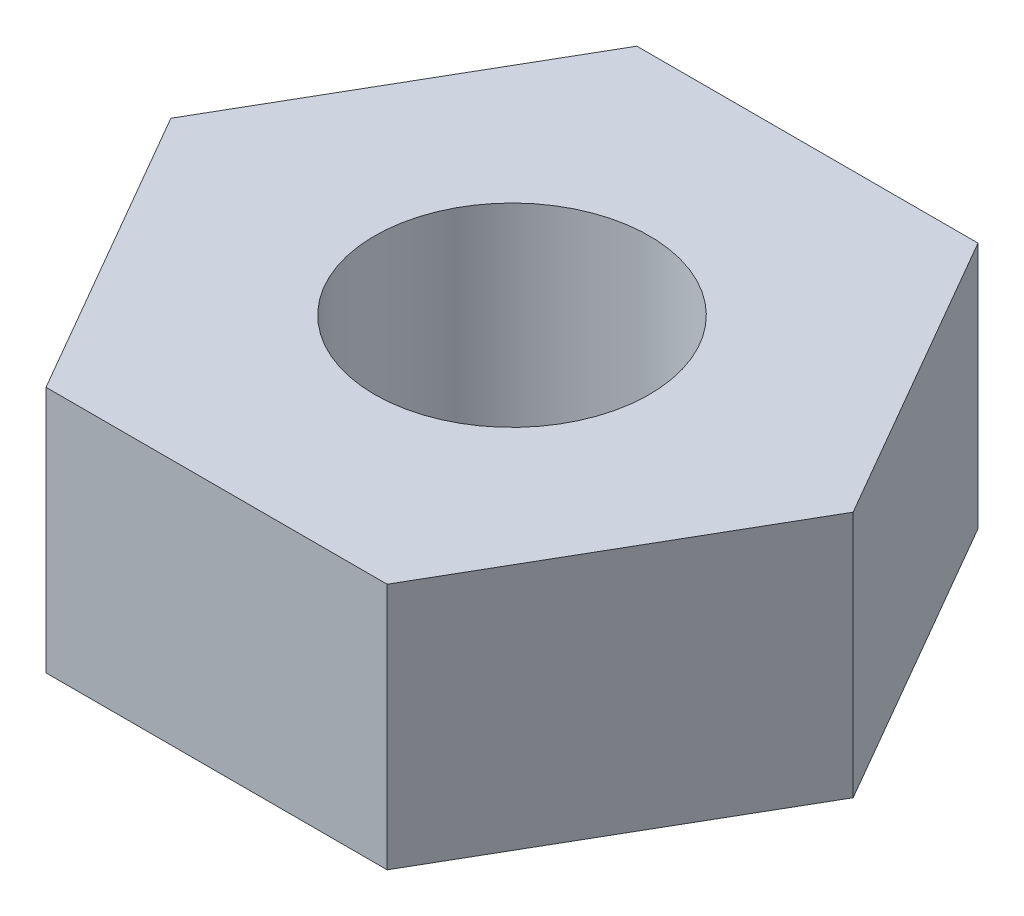
ISO-10303-21;
HEADER;
FILE_DESCRIPTION(('STEP AP214'),'2;1');
FILE_NAME('part.step','',(''),(''),'','','');
FILE_SCHEMA(('AUTOMOTIVE_DESIGN { 1 0 10303 214 1 1 1 1 }'));
ENDSEC;
DATA;
#1=APPLICATION_CONTEXT('core data for automotive mechanical design processes');
#2=APPLICATION_PROTOCOL_DEFINITION('international standard','automotive_design',2000,#1);
#3=PRODUCT_CONTEXT('',#1,'mechanical');
#4=PRODUCT('Part','Part','',(#3));
#5=PRODUCT_RELATED_PRODUCT_CATEGORY('part','',(#4));
#6=PRODUCT_DEFINITION_FORMATION('','',#4);
#7=PRODUCT_DEFINITION_CONTEXT('part definition',#1,'design');
#8=PRODUCT_DEFINITION('design','',#6,#7);
#9=PRODUCT_DEFINITION_SHAPE('','',#8);
#10=(LENGTH_UNIT() NAMED_UNIT(*) SI_UNIT(.MILLI.,.METRE.));
#11=(NAMED_UNIT(*) PLANE_ANGLE_UNIT() SI_UNIT($,.RADIAN.));
#12=(NAMED_UNIT(*) SI_UNIT($,.STERADIAN.) SOLID_ANGLE_UNIT());
#13=UNCERTAINTY_MEASURE_WITH_UNIT(LENGTH_MEASURE(1.E-05),#10,'distance_accuracy_value','');
#14=(GEOMETRIC_REPRESENTATION_CONTEXT(3) GLOBAL_UNCERTAINTY_ASSIGNED_CONTEXT((#13)) GLOBAL_UNIT_ASSIGNED_CONTEXT((#10,
#11,#12)) REPRESENTATION_CONTEXT('',''));
#15=CARTESIAN_POINT('',(0.,0.,0.));
#16=DIRECTION('',(0.,0.,1.));
#17=DIRECTION('',(1.,0.,0.));
#18=AXIS2_PLACEMENT_3D('',#15,#16,#17);
#19=CARTESIAN_POINT('',(0.,3.6,0.));
#20=DIRECTION('',(0.,1.,0.));
#21=DIRECTION('',(0.,0.,1.));
#22=AXIS2_PLACEMENT_3D('',#19,#20,#21);
#23=PLANE('',#22);
#24=DIRECTION('',(0.5,0.,-0.866025403784439));
#25=VECTOR('',#24,1.);
#26=CARTESIAN_POINT('',(2.48260615751539,3.6,4.3));
#27=LINE('',#26,#25);
#28=CARTESIAN_POINT('',(2.48260615751539,3.6,4.3));
#29=VERTEX_POINT('',#28);
#30=CARTESIAN_POINT('',(4.96521231503078,3.6,0.));
#31=VERTEX_POINT('',#30);
#32=EDGE_CURVE('E129',#29,#31,#27,.T.);
#33=ORIENTED_EDGE('',*,*,#32,.T.);
#34=DIRECTION('',(-0.5,0.,-0.866025403784438));
#35=VECTOR('',#34,1.);
#36=CARTESIAN_POINT('',(4.96521231503078,3.6,0.));
#37=LINE('',#36,#35);
#38=CARTESIAN_POINT('',(2.48260615751539,3.6,-4.3));
#39=VERTEX_POINT('',#38);
#40=EDGE_CURVE('E87',#31,#39,#37,.T.);
#41=ORIENTED_EDGE('',*,*,#40,.T.);
#42=DIRECTION('',(-1.,0.,0.));
#43=VECTOR('',#42,1.);
#44=CARTESIAN_POINT('',(2.48260615751539,3.6,-4.3));
#45=LINE('',#44,#43);
#46=CARTESIAN_POINT('',(-2.48260615751539,3.6,-4.3));
#47=VERTEX_POINT('',#46);
#48=EDGE_CURVE('E100',#39,#47,#45,.T.);
#49=ORIENTED_EDGE('',*,*,#48,.T.);
#50=DIRECTION('',(-0.5,0.,0.866025403784439));
#51=VECTOR('',#50,1.);
#52=CARTESIAN_POINT('',(-2.48260615751539,3.6,-4.3));
#53=LINE('',#52,#51);
#54=CARTESIAN_POINT('',(-4.96521231503078,3.6,0.));
#55=VERTEX_POINT('',#54);
#56=EDGE_CURVE('E94',#47,#55,#53,.T.);
#57=ORIENTED_EDGE('',*,*,#56,.T.);
#58=DIRECTION('',(0.5,0.,0.866025403784439));
#59=VECTOR('',#58,1.);
#60=CARTESIAN_POINT('',(-4.96521231503078,3.6,0.));
#61=LINE('',#60,#59);
#62=CARTESIAN_POINT('',(-2.48260615751539,3.6,4.3));
#63=VERTEX_POINT('',#62);
#64=EDGE_CURVE('E98',#55,#63,#61,.T.);
#65=ORIENTED_EDGE('',*,*,#64,.T.);
#66=DIRECTION('',(1.,0.,0.));
#67=VECTOR('',#66,1.);
#68=CARTESIAN_POINT('',(-2.48260615751539,3.6,4.3));
#69=LINE('',#68,#67);
#70=EDGE_CURVE('E50',#63,#29,#69,.T.);
#71=ORIENTED_EDGE('',*,*,#70,.T.);
#72=EDGE_LOOP('',(#33,#41,#49,#57,#65,#71));
#73=FACE_BOUND('',#72,.T.);
#74=CARTESIAN_POINT('',(0.,3.6,0.));
#75=DIRECTION('',(0.,1.,0.));
#76=DIRECTION('',(0.,0.,1.));
#77=AXIS2_PLACEMENT_3D('',#74,#75,#76);
#78=CIRCLE('',#77,2.);
#79=CARTESIAN_POINT('',(0.,3.6,2.));
#80=VERTEX_POINT('',#79);
#81=EDGE_CURVE('E122',#80,#80,#78,.T.);
#82=ORIENTED_EDGE('',*,*,#81,.F.);
#83=EDGE_LOOP('',(#82));
#84=FACE_BOUND('',#83,.T.);
#85=ADVANCED_FACE('F33',(#73,#84),#23,.T.);
#86=CARTESIAN_POINT('',(0.,0.,0.));
#87=DIRECTION('',(0.,1.,0.));
#88=DIRECTION('',(0.,0.,1.));
#89=AXIS2_PLACEMENT_3D('',#86,#87,#88);
#90=PLANE('',#89);
#91=DIRECTION('',(0.5,0.,-0.866025403784439));
#92=VECTOR('',#91,1.);
#93=CARTESIAN_POINT('',(2.48260615751539,0.,4.3));
#94=LINE('',#93,#92);
#95=CARTESIAN_POINT('',(2.48260615751539,0.,4.3));
#96=VERTEX_POINT('',#95);
#97=CARTESIAN_POINT('',(4.96521231503078,0.,0.));
#98=VERTEX_POINT('',#97);
#99=EDGE_CURVE('E118',#96,#98,#94,.T.);
#100=ORIENTED_EDGE('',*,*,#99,.F.);
#101=DIRECTION('',(1.,0.,0.));
#102=VECTOR('',#101,1.);
#103=CARTESIAN_POINT('',(-2.48260615751539,0.,4.3));
#104=LINE('',#103,#102);
#105=CARTESIAN_POINT('',(-2.48260615751539,0.,4.3));
#106=VERTEX_POINT('',#105);
#107=EDGE_CURVE('E79',#106,#96,#104,.T.);
#108=ORIENTED_EDGE('',*,*,#107,.F.);
#109=DIRECTION('',(0.5,0.,0.866025403784439));
#110=VECTOR('',#109,1.);
#111=CARTESIAN_POINT('',(-4.96521231503078,0.,0.));
#112=LINE('',#111,#110);
#113=CARTESIAN_POINT('',(-4.96521231503078,0.,0.));
#114=VERTEX_POINT('',#113);
#115=EDGE_CURVE('E73',#114,#106,#112,.T.);
#116=ORIENTED_EDGE('',*,*,#115,.F.);
#117=DIRECTION('',(-0.5,0.,0.866025403784439));
#118=VECTOR('',#117,1.);
#119=CARTESIAN_POINT('',(-2.48260615751539,0.,-4.3));
#120=LINE('',#119,#118);
#121=CARTESIAN_POINT('',(-2.48260615751539,0.,-4.3));
#122=VERTEX_POINT('',#121);
#123=EDGE_CURVE('E108',#122,#114,#120,.T.);
#124=ORIENTED_EDGE('',*,*,#123,.F.);
#125=DIRECTION('',(-1.,0.,0.));
#126=VECTOR('',#125,1.);
#127=CARTESIAN_POINT('',(2.48260615751539,0.,-4.3));
#128=LINE('',#127,#126);
#129=CARTESIAN_POINT('',(2.48260615751539,0.,-4.3));
#130=VERTEX_POINT('',#129);
#131=EDGE_CURVE('E124',#130,#122,#128,.T.);
#132=ORIENTED_EDGE('',*,*,#131,.F.);
#133=DIRECTION('',(-0.5,0.,-0.866025403784438));
#134=VECTOR('',#133,1.);
#135=CARTESIAN_POINT('',(4.96521231503078,0.,0.));
#136=LINE('',#135,#134);
#137=EDGE_CURVE('E121',#98,#130,#136,.T.);
#138=ORIENTED_EDGE('',*,*,#137,.F.);
#139=EDGE_LOOP('',(#100,#108,#116,#124,#132,#138));
#140=FACE_BOUND('',#139,.T.);
#141=CARTESIAN_POINT('',(0.,0.,0.));
#142=DIRECTION('',(0.,1.,0.));
#143=DIRECTION('',(0.,0.,1.));
#144=AXIS2_PLACEMENT_3D('',#141,#142,#143);
#145=CIRCLE('',#144,2.);
#146=CARTESIAN_POINT('',(0.,0.,2.));
#147=VERTEX_POINT('',#146);
#148=EDGE_CURVE('E222',#147,#147,#145,.T.);
#149=ORIENTED_EDGE('',*,*,#148,.T.);
#150=EDGE_LOOP('',(#149));
#151=FACE_BOUND('',#150,.T.);
#152=ADVANCED_FACE('F138',(#140,#151),#90,.F.);
#153=CARTESIAN_POINT('',(2.48260615751539,3.6,4.3));
#154=DIRECTION('',(-0.866025403784439,0.,-0.5));
#155=DIRECTION('',(-0.5,0.,0.866025403784439));
#156=AXIS2_PLACEMENT_3D('',#153,#154,#155);
#157=PLANE('',#156);
#158=ORIENTED_EDGE('',*,*,#99,.T.);
#159=DIRECTION('',(0.,-1.,0.));
#160=VECTOR('',#159,1.);
#161=CARTESIAN_POINT('',(4.96521231503078,3.6,0.));
#162=LINE('',#161,#160);
#163=EDGE_CURVE('E11',#31,#98,#162,.T.);
#164=ORIENTED_EDGE('',*,*,#163,.F.);
#165=ORIENTED_EDGE('',*,*,#32,.F.);
#166=DIRECTION('',(0.,-1.,0.));
#167=VECTOR('',#166,1.);
#168=CARTESIAN_POINT('',(2.48260615751539,3.6,4.3));
#169=LINE('',#168,#167);
#170=EDGE_CURVE('E114',#29,#96,#169,.T.);
#171=ORIENTED_EDGE('',*,*,#170,.T.);
#172=EDGE_LOOP('',(#158,#164,#165,#171));
#173=FACE_BOUND('',#172,.T.);
#174=ADVANCED_FACE('F35',(#173),#157,.F.);
#175=CARTESIAN_POINT('',(4.96521231503078,3.6,0.));
#176=DIRECTION('',(-0.866025403784438,0.,0.5));
#177=DIRECTION('',(0.5,0.,0.866025403784439));
#178=AXIS2_PLACEMENT_3D('',#175,#176,#177);
#179=PLANE('',#178);
#180=ORIENTED_EDGE('',*,*,#137,.T.);
#181=DIRECTION('',(0.,-1.,0.));
#182=VECTOR('',#181,1.);
#183=CARTESIAN_POINT('',(2.48260615751539,3.6,-4.3));
#184=LINE('',#183,#182);
#185=EDGE_CURVE('E42',#39,#130,#184,.T.);
#186=ORIENTED_EDGE('',*,*,#185,.F.);
#187=ORIENTED_EDGE('',*,*,#40,.F.);
#188=ORIENTED_EDGE('',*,*,#163,.T.);
#189=EDGE_LOOP('',(#180,#186,#187,#188));
#190=FACE_BOUND('',#189,.T.);
#191=ADVANCED_FACE('F163',(#190),#179,.F.);
#192=CARTESIAN_POINT('',(2.48260615751539,3.6,-4.3));
#193=DIRECTION('',(0.,0.,1.));
#194=DIRECTION('',(1.,0.,0.));
#195=AXIS2_PLACEMENT_3D('',#192,#193,#194);
#196=PLANE('',#195);
#197=ORIENTED_EDGE('',*,*,#131,.T.);
#198=DIRECTION('',(0.,-1.,0.));
#199=VECTOR('',#198,1.);
#200=CARTESIAN_POINT('',(-2.48260615751539,3.6,-4.3));
#201=LINE('',#200,#199);
#202=EDGE_CURVE('E109',#47,#122,#201,.T.);
#203=ORIENTED_EDGE('',*,*,#202,.F.);
#204=ORIENTED_EDGE('',*,*,#48,.F.);
#205=ORIENTED_EDGE('',*,*,#185,.T.);
#206=EDGE_LOOP('',(#197,#203,#204,#205));
#207=FACE_BOUND('',#206,.T.);
#208=ADVANCED_FACE('F135',(#207),#196,.F.);
#209=CARTESIAN_POINT('',(-2.48260615751539,3.6,-4.3));
#210=DIRECTION('',(0.866025403784439,0.,0.5));
#211=DIRECTION('',(0.5,0.,-0.866025403784439));
#212=AXIS2_PLACEMENT_3D('',#209,#210,#211);
#213=PLANE('',#212);
#214=ORIENTED_EDGE('',*,*,#123,.T.);
#215=DIRECTION('',(0.,-1.,0.));
#216=VECTOR('',#215,1.);
#217=CARTESIAN_POINT('',(-4.96521231503078,3.6,0.));
#218=LINE('',#217,#216);
#219=EDGE_CURVE('E105',#55,#114,#218,.T.);
#220=ORIENTED_EDGE('',*,*,#219,.F.);
#221=ORIENTED_EDGE('',*,*,#56,.F.);
#222=ORIENTED_EDGE('',*,*,#202,.T.);
#223=EDGE_LOOP('',(#214,#220,#221,#222));
#224=FACE_BOUND('',#223,.T.);
#225=ADVANCED_FACE('F106',(#224),#213,.F.);
#226=CARTESIAN_POINT('',(-4.96521231503078,3.6,0.));
#227=DIRECTION('',(0.866025403784439,0.,-0.5));
#228=DIRECTION('',(-0.5,0.,-0.866025403784439));
#229=AXIS2_PLACEMENT_3D('',#226,#227,#228);
#230=PLANE('',#229);
#231=ORIENTED_EDGE('',*,*,#115,.T.);
#232=DIRECTION('',(0.,-1.,0.));
#233=VECTOR('',#232,1.);
#234=CARTESIAN_POINT('',(-2.48260615751539,3.6,4.3));
#235=LINE('',#234,#233);
#236=EDGE_CURVE('E110',#63,#106,#235,.T.);
#237=ORIENTED_EDGE('',*,*,#236,.F.);
#238=ORIENTED_EDGE('',*,*,#64,.F.);
#239=ORIENTED_EDGE('',*,*,#219,.T.);
#240=EDGE_LOOP('',(#231,#237,#238,#239));
#241=FACE_BOUND('',#240,.T.);
#242=ADVANCED_FACE('F112',(#241),#230,.F.);
#243=CARTESIAN_POINT('',(-2.48260615751539,3.6,4.3));
#244=DIRECTION('',(0.,0.,-1.));
#245=DIRECTION('',(-1.,0.,0.));
#246=AXIS2_PLACEMENT_3D('',#243,#244,#245);
#247=PLANE('',#246);
#248=ORIENTED_EDGE('',*,*,#107,.T.);
#249=ORIENTED_EDGE('',*,*,#170,.F.);
#250=ORIENTED_EDGE('',*,*,#70,.F.);
#251=ORIENTED_EDGE('',*,*,#236,.T.);
#252=EDGE_LOOP('',(#248,#249,#250,#251));
#253=FACE_BOUND('',#252,.T.);
#254=ADVANCED_FACE('F143',(#253),#247,.F.);
#255=CARTESIAN_POINT('',(0.,3.6,0.));
#256=DIRECTION('',(0.,-1.,0.));
#257=DIRECTION('',(0.,0.,-1.));
#258=AXIS2_PLACEMENT_3D('',#255,#256,#257);
#259=CYLINDRICAL_SURFACE('',#258,2.);
#260=ORIENTED_EDGE('',*,*,#81,.T.);
#261=EDGE_LOOP('',(#260));
#262=FACE_BOUND('',#261,.T.);
#263=ORIENTED_EDGE('',*,*,#148,.F.);
#264=EDGE_LOOP('',(#263));
#265=FACE_BOUND('',#264,.T.);
#266=ADVANCED_FACE('F145',(#262,#265),#259,.F.);
#267=CLOSED_SHELL('',(#85,#152,#174,#191,#208,#225,#242,#254,#266));
#268=MANIFOLD_SOLID_BREP('B2',#267);
#269=ADVANCED_BREP_SHAPE_REPRESENTATION('',(#18,#268),#14);
#270=SHAPE_DEFINITION_REPRESENTATION(#9,#269);
ENDSEC;
END-ISO-10303-21;
